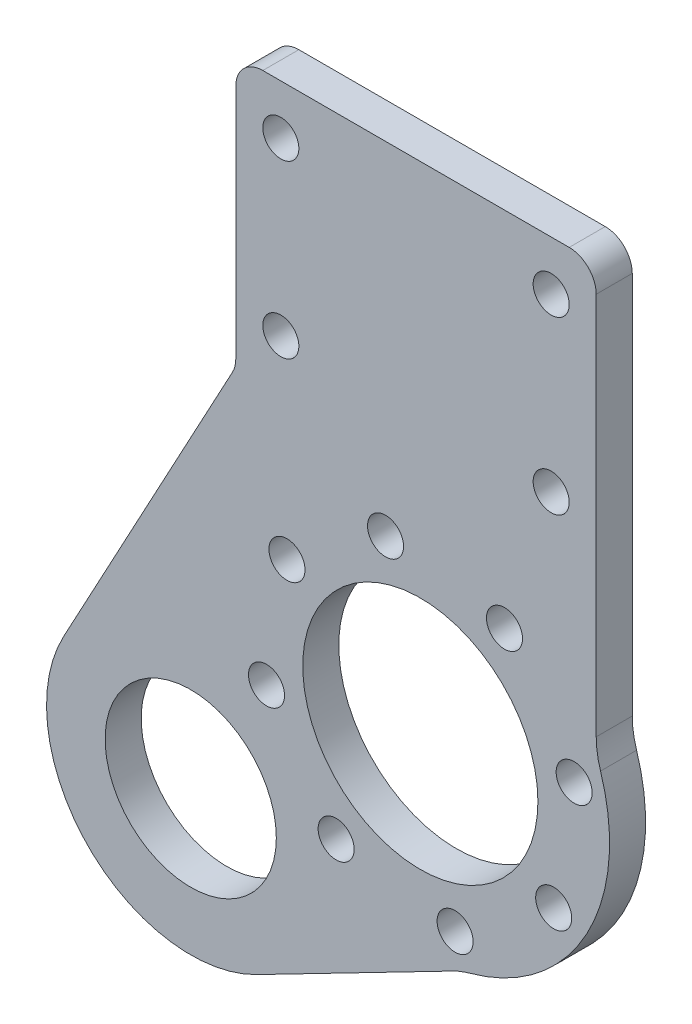
ISO-10303-21;
HEADER;
FILE_DESCRIPTION(('STEP AP214'),'2;1');
FILE_NAME('part.step','',(''),(''),'','','');
FILE_SCHEMA(('AUTOMOTIVE_DESIGN { 1 0 10303 214 1 1 1 1 }'));
ENDSEC;
DATA;
#1=APPLICATION_CONTEXT('core data for automotive mechanical design processes');
#2=APPLICATION_PROTOCOL_DEFINITION('international standard','automotive_design',2000,#1);
#3=PRODUCT_CONTEXT('',#1,'mechanical');
#4=PRODUCT('Part','Part','',(#3));
#5=PRODUCT_RELATED_PRODUCT_CATEGORY('part','',(#4));
#6=PRODUCT_DEFINITION_FORMATION('','',#4);
#7=PRODUCT_DEFINITION_CONTEXT('part definition',#1,'design');
#8=PRODUCT_DEFINITION('design','',#6,#7);
#9=PRODUCT_DEFINITION_SHAPE('','',#8);
#10=(LENGTH_UNIT() NAMED_UNIT(*) SI_UNIT(.MILLI.,.METRE.));
#11=(NAMED_UNIT(*) PLANE_ANGLE_UNIT() SI_UNIT($,.RADIAN.));
#12=(NAMED_UNIT(*) SI_UNIT($,.STERADIAN.) SOLID_ANGLE_UNIT());
#13=UNCERTAINTY_MEASURE_WITH_UNIT(LENGTH_MEASURE(1.E-05),#10,'distance_accuracy_value','');
#14=(GEOMETRIC_REPRESENTATION_CONTEXT(3) GLOBAL_UNCERTAINTY_ASSIGNED_CONTEXT((#13)) GLOBAL_UNIT_ASSIGNED_CONTEXT((#10,
#11,#12)) REPRESENTATION_CONTEXT('',''));
#15=CARTESIAN_POINT('',(0.,0.,0.));
#16=DIRECTION('',(0.,0.,1.));
#17=DIRECTION('',(1.,0.,0.));
#18=AXIS2_PLACEMENT_3D('',#15,#16,#17);
#19=CARTESIAN_POINT('',(24.,18.,4.));
#20=DIRECTION('',(0.,0.,1.));
#21=DIRECTION('',(1.,0.,0.));
#22=AXIS2_PLACEMENT_3D('',#19,#20,#21);
#23=PLANE('',#22);
#24=CARTESIAN_POINT('',(21.6211386934791,35.06924689074,4.));
#25=DIRECTION('',(0.,0.,1.));
#26=DIRECTION('',(1.,0.,0.));
#27=AXIS2_PLACEMENT_3D('',#24,#25,#26);
#28=CIRCLE('',#27,2.00000000000001);
#29=CARTESIAN_POINT('',(23.6211386934791,35.06924689074,4.));
#30=VERTEX_POINT('',#29);
#31=EDGE_CURVE('E563',#30,#30,#28,.T.);
#32=ORIENTED_EDGE('',*,*,#31,.F.);
#33=EDGE_LOOP('',(#32));
#34=FACE_BOUND('',#33,.T.);
#35=CARTESIAN_POINT('',(34.8211532286903,32.7984072236889,4.));
#36=DIRECTION('',(0.,0.,1.));
#37=DIRECTION('',(1.,0.,0.));
#38=AXIS2_PLACEMENT_3D('',#35,#36,#37);
#39=CIRCLE('',#38,2.);
#40=CARTESIAN_POINT('',(36.8211532286903,32.7984072236889,4.));
#41=VERTEX_POINT('',#40);
#42=EDGE_CURVE('E560',#41,#41,#39,.T.);
#43=ORIENTED_EDGE('',*,*,#42,.F.);
#44=EDGE_LOOP('',(#43));
#45=FACE_BOUND('',#44,.T.);
#46=CARTESIAN_POINT('',(42.54924689074,21.8588613065209,4.));
#47=DIRECTION('',(0.,0.,1.));
#48=DIRECTION('',(1.,0.,0.));
#49=AXIS2_PLACEMENT_3D('',#46,#47,#48);
#50=CIRCLE('',#49,2.);
#51=CARTESIAN_POINT('',(44.54924689074,21.8588613065209,4.));
#52=VERTEX_POINT('',#51);
#53=EDGE_CURVE('E566',#52,#52,#50,.T.);
#54=ORIENTED_EDGE('',*,*,#53,.F.);
#55=EDGE_LOOP('',(#54));
#56=FACE_BOUND('',#55,.T.);
#57=CARTESIAN_POINT('',(40.2784072236889,8.65884677130965,4.));
#58=DIRECTION('',(0.,0.,1.));
#59=DIRECTION('',(1.,0.,0.));
#60=AXIS2_PLACEMENT_3D('',#57,#58,#59);
#61=CIRCLE('',#60,2.);
#62=CARTESIAN_POINT('',(42.2784072236889,8.65884677130965,4.));
#63=VERTEX_POINT('',#62);
#64=EDGE_CURVE('E575',#63,#63,#61,.T.);
#65=ORIENTED_EDGE('',*,*,#64,.F.);
#66=EDGE_LOOP('',(#65));
#67=FACE_BOUND('',#66,.T.);
#68=CARTESIAN_POINT('',(29.3388613065209,0.930753109260019,4.));
#69=DIRECTION('',(0.,0.,1.));
#70=DIRECTION('',(1.,0.,0.));
#71=AXIS2_PLACEMENT_3D('',#68,#69,#70);
#72=CIRCLE('',#71,2.);
#73=CARTESIAN_POINT('',(31.3388613065209,0.930753109260019,4.));
#74=VERTEX_POINT('',#73);
#75=EDGE_CURVE('E641',#74,#74,#72,.T.);
#76=ORIENTED_EDGE('',*,*,#75,.F.);
#77=EDGE_LOOP('',(#76));
#78=FACE_BOUND('',#77,.T.);
#79=CARTESIAN_POINT('',(16.1388467713097,3.20159277631108,4.));
#80=DIRECTION('',(0.,0.,1.));
#81=DIRECTION('',(1.,0.,0.));
#82=AXIS2_PLACEMENT_3D('',#79,#80,#81);
#83=CIRCLE('',#82,2.);
#84=CARTESIAN_POINT('',(18.1388467713097,3.20159277631108,4.));
#85=VERTEX_POINT('',#84);
#86=EDGE_CURVE('E634',#85,#85,#83,.T.);
#87=ORIENTED_EDGE('',*,*,#86,.F.);
#88=EDGE_LOOP('',(#87));
#89=FACE_BOUND('',#88,.T.);
#90=CARTESIAN_POINT('',(8.41075310926003,14.1411386934791,4.));
#91=DIRECTION('',(0.,0.,1.));
#92=DIRECTION('',(1.,0.,0.));
#93=AXIS2_PLACEMENT_3D('',#90,#91,#92);
#94=CIRCLE('',#93,2.);
#95=CARTESIAN_POINT('',(10.41075310926,14.1411386934791,4.));
#96=VERTEX_POINT('',#95);
#97=EDGE_CURVE('E635',#96,#96,#94,.T.);
#98=ORIENTED_EDGE('',*,*,#97,.F.);
#99=EDGE_LOOP('',(#98));
#100=FACE_BOUND('',#99,.T.);
#101=CARTESIAN_POINT('',(10.6815927763111,27.3411532286903,4.));
#102=DIRECTION('',(0.,0.,1.));
#103=DIRECTION('',(1.,0.,0.));
#104=AXIS2_PLACEMENT_3D('',#101,#102,#103);
#105=CIRCLE('',#104,2.);
#106=CARTESIAN_POINT('',(12.6815927763111,27.3411532286903,4.));
#107=VERTEX_POINT('',#106);
#108=EDGE_CURVE('E581',#107,#107,#105,.T.);
#109=ORIENTED_EDGE('',*,*,#108,.F.);
#110=EDGE_LOOP('',(#109));
#111=FACE_BOUND('',#110,.T.);
#112=CARTESIAN_POINT('',(25.48,18.,4.));
#113=DIRECTION('',(0.,0.,1.));
#114=DIRECTION('',(1.,0.,0.));
#115=AXIS2_PLACEMENT_3D('',#112,#113,#114);
#116=CIRCLE('',#115,13.05);
#117=CARTESIAN_POINT('',(38.53,18.,4.));
#118=VERTEX_POINT('',#117);
#119=EDGE_CURVE('E587',#118,#118,#116,.T.);
#120=ORIENTED_EDGE('',*,*,#119,.F.);
#121=EDGE_LOOP('',(#120));
#122=FACE_BOUND('',#121,.T.);
#123=DIRECTION('',(0.888810637746616,0.458274644976628,0.));
#124=VECTOR('',#123,1.);
#125=CARTESIAN_POINT('',(7.33239431962605,-14.2209702039459,4.));
#126=LINE('',#125,#124);
#127=CARTESIAN_POINT('',(7.33239431962604,-14.2209702039459,4.));
#128=VERTEX_POINT('',#127);
#129=CARTESIAN_POINT('',(29.0608900410088,-3.01766295299055,4.));
#130=VERTEX_POINT('',#129);
#131=EDGE_CURVE('E132',#128,#130,#126,.T.);
#132=ORIENTED_EDGE('',*,*,#131,.T.);
#133=CARTESIAN_POINT('',(33.6436364907751,-11.9057693304567,4.));
#134=DIRECTION('',(0.,0.,1.));
#135=DIRECTION('',(1.,0.,0.));
#136=AXIS2_PLACEMENT_3D('',#133,#134,#135);
#137=CIRCLE('',#136,10.);
#138=CARTESIAN_POINT('',(31.0102053647186,-2.25874696579326,4.));
#139=VERTEX_POINT('',#138);
#140=EDGE_CURVE('E230',#130,#139,#137,.F.);
#141=ORIENTED_EDGE('',*,*,#140,.T.);
#142=CARTESIAN_POINT('',(25.48,18.,4.));
#143=DIRECTION('',(0.,0.,1.));
#144=DIRECTION('',(1.,0.,0.));
#145=AXIS2_PLACEMENT_3D('',#142,#143,#144);
#146=CIRCLE('',#145,21.);
#147=CARTESIAN_POINT('',(45.4774193548387,24.4111792321477,4.));
#148=VERTEX_POINT('',#147);
#149=EDGE_CURVE('E246',#139,#148,#146,.T.);
#150=ORIENTED_EDGE('',*,*,#149,.T.);
#151=CARTESIAN_POINT('',(55.,27.4641217236466,4.));
#152=DIRECTION('',(0.,0.,1.));
#153=DIRECTION('',(1.,0.,0.));
#154=AXIS2_PLACEMENT_3D('',#151,#152,#153);
#155=CIRCLE('',#154,10.);
#156=CARTESIAN_POINT('',(45.,27.4641217236466,4.));
#157=VERTEX_POINT('',#156);
#158=EDGE_CURVE('E11',#148,#157,#155,.F.);
#159=ORIENTED_EDGE('',*,*,#158,.T.);
#160=DIRECTION('',(0.,1.,0.));
#161=VECTOR('',#160,1.);
#162=CARTESIAN_POINT('',(45.,73.,4.));
#163=LINE('',#162,#161);
#164=CARTESIAN_POINT('',(45.,70.,4.));
#165=VERTEX_POINT('',#164);
#166=EDGE_CURVE('E173',#157,#165,#163,.T.);
#167=ORIENTED_EDGE('',*,*,#166,.T.);
#168=CARTESIAN_POINT('',(42.,70.,4.));
#169=DIRECTION('',(0.,0.,1.));
#170=DIRECTION('',(1.,0.,0.));
#171=AXIS2_PLACEMENT_3D('',#168,#169,#170);
#172=CIRCLE('',#171,3.);
#173=CARTESIAN_POINT('',(42.,73.,4.));
#174=VERTEX_POINT('',#173);
#175=EDGE_CURVE('E193',#165,#174,#172,.T.);
#176=ORIENTED_EDGE('',*,*,#175,.T.);
#177=DIRECTION('',(-1.,0.,0.));
#178=VECTOR('',#177,1.);
#179=CARTESIAN_POINT('',(-16.,73.,4.));
#180=LINE('',#179,#178);
#181=CARTESIAN_POINT('',(8.,73.,4.));
#182=VERTEX_POINT('',#181);
#183=EDGE_CURVE('E133',#174,#182,#180,.T.);
#184=ORIENTED_EDGE('',*,*,#183,.T.);
#185=CARTESIAN_POINT('',(8.,70.,4.));
#186=DIRECTION('',(0.,0.,1.));
#187=DIRECTION('',(1.,0.,0.));
#188=AXIS2_PLACEMENT_3D('',#185,#186,#187);
#189=CIRCLE('',#188,3.);
#190=CARTESIAN_POINT('',(5.,70.,4.));
#191=VERTEX_POINT('',#190);
#192=EDGE_CURVE('E206',#182,#191,#189,.T.);
#193=ORIENTED_EDGE('',*,*,#192,.T.);
#194=DIRECTION('',(0.,1.,0.));
#195=VECTOR('',#194,1.);
#196=CARTESIAN_POINT('',(5.,43.,4.));
#197=LINE('',#196,#195);
#198=CARTESIAN_POINT('',(5.,43.7569898030261,4.));
#199=VERTEX_POINT('',#198);
#200=EDGE_CURVE('E144',#199,#191,#197,.T.);
#201=ORIENTED_EDGE('',*,*,#200,.F.);
#202=CARTESIAN_POINT('',(2.,43.7569898030261,4.));
#203=DIRECTION('',(0.,0.,1.));
#204=DIRECTION('',(1.,0.,0.));
#205=AXIS2_PLACEMENT_3D('',#202,#203,#204);
#206=CIRCLE('',#205,3.);
#207=CARTESIAN_POINT('',(4.64084515644005,42.333635715068,4.));
#208=VERTEX_POINT('',#207);
#209=EDGE_CURVE('E148',#199,#208,#206,.F.);
#210=ORIENTED_EDGE('',*,*,#209,.T.);
#211=DIRECTION('',(0.474451362652715,0.880281718813348,0.));
#212=VECTOR('',#211,1.);
#213=CARTESIAN_POINT('',(-14.0845075010136,7.59122180244344,4.));
#214=LINE('',#213,#212);
#215=CARTESIAN_POINT('',(-14.0845075010136,7.59122180244344,4.));
#216=VERTEX_POINT('',#215);
#217=EDGE_CURVE('E139',#216,#208,#214,.T.);
#218=ORIENTED_EDGE('',*,*,#217,.F.);
#219=CARTESIAN_POINT('',(0.,0.,4.));
#220=DIRECTION('',(0.,0.,1.));
#221=DIRECTION('',(1.,0.,0.));
#222=AXIS2_PLACEMENT_3D('',#219,#220,#221);
#223=CIRCLE('',#222,16.);
#224=EDGE_CURVE('E123',#216,#128,#223,.T.);
#225=ORIENTED_EDGE('',*,*,#224,.T.);
#226=EDGE_LOOP('',(#132,#141,#150,#159,#167,#176,#184,#193,#201,#210,#218,#225));
#227=FACE_BOUND('',#226,.T.);
#228=CARTESIAN_POINT('',(40.,48.5,4.));
#229=DIRECTION('',(0.,0.,1.));
#230=DIRECTION('',(1.,0.,0.));
#231=AXIS2_PLACEMENT_3D('',#228,#229,#230);
#232=CIRCLE('',#231,2.);
#233=CARTESIAN_POINT('',(42.,48.5,4.));
#234=VERTEX_POINT('',#233);
#235=EDGE_CURVE('E245',#234,#234,#232,.T.);
#236=ORIENTED_EDGE('',*,*,#235,.F.);
#237=EDGE_LOOP('',(#236));
#238=FACE_BOUND('',#237,.T.);
#239=CARTESIAN_POINT('',(9.99999999999999,48.5,4.));
#240=DIRECTION('',(0.,0.,1.));
#241=DIRECTION('',(1.,0.,0.));
#242=AXIS2_PLACEMENT_3D('',#239,#240,#241);
#243=CIRCLE('',#242,2.);
#244=CARTESIAN_POINT('',(12.,48.5,4.));
#245=VERTEX_POINT('',#244);
#246=EDGE_CURVE('E595',#245,#245,#243,.T.);
#247=ORIENTED_EDGE('',*,*,#246,.F.);
#248=EDGE_LOOP('',(#247));
#249=FACE_BOUND('',#248,.T.);
#250=CARTESIAN_POINT('',(9.99999999999999,67.5,4.));
#251=DIRECTION('',(0.,0.,1.));
#252=DIRECTION('',(1.,0.,0.));
#253=AXIS2_PLACEMENT_3D('',#250,#251,#252);
#254=CIRCLE('',#253,2.);
#255=CARTESIAN_POINT('',(12.,67.5,4.));
#256=VERTEX_POINT('',#255);
#257=EDGE_CURVE('E592',#256,#256,#254,.T.);
#258=ORIENTED_EDGE('',*,*,#257,.F.);
#259=EDGE_LOOP('',(#258));
#260=FACE_BOUND('',#259,.T.);
#261=CARTESIAN_POINT('',(40.,67.5,4.));
#262=DIRECTION('',(0.,0.,1.));
#263=DIRECTION('',(1.,0.,0.));
#264=AXIS2_PLACEMENT_3D('',#261,#262,#263);
#265=CIRCLE('',#264,2.);
#266=CARTESIAN_POINT('',(42.,67.5,4.));
#267=VERTEX_POINT('',#266);
#268=EDGE_CURVE('E157',#267,#267,#265,.T.);
#269=ORIENTED_EDGE('',*,*,#268,.F.);
#270=EDGE_LOOP('',(#269));
#271=FACE_BOUND('',#270,.T.);
#272=CARTESIAN_POINT('',(0.,0.,4.));
#273=DIRECTION('',(0.,0.,1.));
#274=DIRECTION('',(1.,0.,0.));
#275=AXIS2_PLACEMENT_3D('',#272,#273,#274);
#276=CIRCLE('',#275,9.5);
#277=CARTESIAN_POINT('',(9.5,0.,4.));
#278=VERTEX_POINT('',#277);
#279=EDGE_CURVE('E163',#278,#278,#276,.T.);
#280=ORIENTED_EDGE('',*,*,#279,.F.);
#281=EDGE_LOOP('',(#280));
#282=FACE_BOUND('',#281,.T.);
#283=ADVANCED_FACE('F35',(#34,#45,#56,#67,#78,#89,#100,#111,#122,#227,#238,#249,#260,#271,#282),
#23,.T.);
#284=CARTESIAN_POINT('',(24.,18.,0.));
#285=DIRECTION('',(0.,0.,1.));
#286=DIRECTION('',(1.,0.,0.));
#287=AXIS2_PLACEMENT_3D('',#284,#285,#286);
#288=PLANE('',#287);
#289=CARTESIAN_POINT('',(21.6211386934791,35.06924689074,0.));
#290=DIRECTION('',(0.,0.,1.));
#291=DIRECTION('',(1.,0.,0.));
#292=AXIS2_PLACEMENT_3D('',#289,#290,#291);
#293=CIRCLE('',#292,2.00000000000001);
#294=CARTESIAN_POINT('',(23.6211386934791,35.06924689074,0.));
#295=VERTEX_POINT('',#294);
#296=EDGE_CURVE('E569',#295,#295,#293,.F.);
#297=ORIENTED_EDGE('',*,*,#296,.F.);
#298=EDGE_LOOP('',(#297));
#299=FACE_BOUND('',#298,.T.);
#300=CARTESIAN_POINT('',(34.8211532286903,32.7984072236889,0.));
#301=DIRECTION('',(0.,0.,1.));
#302=DIRECTION('',(1.,0.,0.));
#303=AXIS2_PLACEMENT_3D('',#300,#301,#302);
#304=CIRCLE('',#303,2.);
#305=CARTESIAN_POINT('',(36.8211532286903,32.7984072236889,0.));
#306=VERTEX_POINT('',#305);
#307=EDGE_CURVE('E557',#306,#306,#304,.F.);
#308=ORIENTED_EDGE('',*,*,#307,.F.);
#309=EDGE_LOOP('',(#308));
#310=FACE_BOUND('',#309,.T.);
#311=CARTESIAN_POINT('',(42.54924689074,21.8588613065209,0.));
#312=DIRECTION('',(0.,0.,1.));
#313=DIRECTION('',(1.,0.,0.));
#314=AXIS2_PLACEMENT_3D('',#311,#312,#313);
#315=CIRCLE('',#314,2.);
#316=CARTESIAN_POINT('',(44.54924689074,21.8588613065209,0.));
#317=VERTEX_POINT('',#316);
#318=EDGE_CURVE('E561',#317,#317,#315,.F.);
#319=ORIENTED_EDGE('',*,*,#318,.F.);
#320=EDGE_LOOP('',(#319));
#321=FACE_BOUND('',#320,.T.);
#322=CARTESIAN_POINT('',(40.2784072236889,8.65884677130965,0.));
#323=DIRECTION('',(0.,0.,1.));
#324=DIRECTION('',(1.,0.,0.));
#325=AXIS2_PLACEMENT_3D('',#322,#323,#324);
#326=CIRCLE('',#325,2.);
#327=CARTESIAN_POINT('',(42.2784072236889,8.65884677130965,0.));
#328=VERTEX_POINT('',#327);
#329=EDGE_CURVE('E573',#328,#328,#326,.F.);
#330=ORIENTED_EDGE('',*,*,#329,.F.);
#331=EDGE_LOOP('',(#330));
#332=FACE_BOUND('',#331,.T.);
#333=CARTESIAN_POINT('',(29.3388613065209,0.930753109260019,0.));
#334=DIRECTION('',(0.,0.,1.));
#335=DIRECTION('',(1.,0.,0.));
#336=AXIS2_PLACEMENT_3D('',#333,#334,#335);
#337=CIRCLE('',#336,2.);
#338=CARTESIAN_POINT('',(31.3388613065209,0.930753109260019,0.));
#339=VERTEX_POINT('',#338);
#340=EDGE_CURVE('E578',#339,#339,#337,.F.);
#341=ORIENTED_EDGE('',*,*,#340,.F.);
#342=EDGE_LOOP('',(#341));
#343=FACE_BOUND('',#342,.T.);
#344=CARTESIAN_POINT('',(16.1388467713097,3.20159277631108,0.));
#345=DIRECTION('',(0.,0.,1.));
#346=DIRECTION('',(1.,0.,0.));
#347=AXIS2_PLACEMENT_3D('',#344,#345,#346);
#348=CIRCLE('',#347,2.);
#349=CARTESIAN_POINT('',(18.1388467713097,3.20159277631108,0.));
#350=VERTEX_POINT('',#349);
#351=EDGE_CURVE('E638',#350,#350,#348,.F.);
#352=ORIENTED_EDGE('',*,*,#351,.F.);
#353=EDGE_LOOP('',(#352));
#354=FACE_BOUND('',#353,.T.);
#355=CARTESIAN_POINT('',(8.41075310926003,14.1411386934791,0.));
#356=DIRECTION('',(0.,0.,1.));
#357=DIRECTION('',(1.,0.,0.));
#358=AXIS2_PLACEMENT_3D('',#355,#356,#357);
#359=CIRCLE('',#358,2.);
#360=CARTESIAN_POINT('',(10.41075310926,14.1411386934791,0.));
#361=VERTEX_POINT('',#360);
#362=EDGE_CURVE('E631',#361,#361,#359,.F.);
#363=ORIENTED_EDGE('',*,*,#362,.F.);
#364=EDGE_LOOP('',(#363));
#365=FACE_BOUND('',#364,.T.);
#366=CARTESIAN_POINT('',(10.6815927763111,27.3411532286903,0.));
#367=DIRECTION('',(0.,0.,1.));
#368=DIRECTION('',(1.,0.,0.));
#369=AXIS2_PLACEMENT_3D('',#366,#367,#368);
#370=CIRCLE('',#369,2.);
#371=CARTESIAN_POINT('',(12.6815927763111,27.3411532286903,0.));
#372=VERTEX_POINT('',#371);
#373=EDGE_CURVE('E584',#372,#372,#370,.F.);
#374=ORIENTED_EDGE('',*,*,#373,.F.);
#375=EDGE_LOOP('',(#374));
#376=FACE_BOUND('',#375,.T.);
#377=CARTESIAN_POINT('',(25.48,18.,0.));
#378=DIRECTION('',(0.,0.,1.));
#379=DIRECTION('',(1.,0.,0.));
#380=AXIS2_PLACEMENT_3D('',#377,#378,#379);
#381=CIRCLE('',#380,13.05);
#382=CARTESIAN_POINT('',(38.53,18.,0.));
#383=VERTEX_POINT('',#382);
#384=EDGE_CURVE('E276',#383,#383,#381,.F.);
#385=ORIENTED_EDGE('',*,*,#384,.F.);
#386=EDGE_LOOP('',(#385));
#387=FACE_BOUND('',#386,.T.);
#388=CARTESIAN_POINT('',(40.,48.5,0.));
#389=DIRECTION('',(0.,0.,1.));
#390=DIRECTION('',(1.,0.,0.));
#391=AXIS2_PLACEMENT_3D('',#388,#389,#390);
#392=CIRCLE('',#391,2.);
#393=CARTESIAN_POINT('',(42.,48.5,0.));
#394=VERTEX_POINT('',#393);
#395=EDGE_CURVE('E149',#394,#394,#392,.T.);
#396=ORIENTED_EDGE('',*,*,#395,.T.);
#397=EDGE_LOOP('',(#396));
#398=FACE_BOUND('',#397,.T.);
#399=CARTESIAN_POINT('',(9.99999999999999,48.5,0.));
#400=DIRECTION('',(0.,0.,1.));
#401=DIRECTION('',(1.,0.,0.));
#402=AXIS2_PLACEMENT_3D('',#399,#400,#401);
#403=CIRCLE('',#402,2.);
#404=CARTESIAN_POINT('',(12.,48.5,0.));
#405=VERTEX_POINT('',#404);
#406=EDGE_CURVE('E154',#405,#405,#403,.T.);
#407=ORIENTED_EDGE('',*,*,#406,.T.);
#408=EDGE_LOOP('',(#407));
#409=FACE_BOUND('',#408,.T.);
#410=CARTESIAN_POINT('',(9.99999999999999,67.5,0.));
#411=DIRECTION('',(0.,0.,1.));
#412=DIRECTION('',(1.,0.,0.));
#413=AXIS2_PLACEMENT_3D('',#410,#411,#412);
#414=CIRCLE('',#413,2.);
#415=CARTESIAN_POINT('',(12.,67.5,0.));
#416=VERTEX_POINT('',#415);
#417=EDGE_CURVE('E217',#416,#416,#414,.T.);
#418=ORIENTED_EDGE('',*,*,#417,.T.);
#419=EDGE_LOOP('',(#418));
#420=FACE_BOUND('',#419,.T.);
#421=CARTESIAN_POINT('',(40.,67.5,0.));
#422=DIRECTION('',(0.,0.,1.));
#423=DIRECTION('',(1.,0.,0.));
#424=AXIS2_PLACEMENT_3D('',#421,#422,#423);
#425=CIRCLE('',#424,2.);
#426=CARTESIAN_POINT('',(42.,67.5,0.));
#427=VERTEX_POINT('',#426);
#428=EDGE_CURVE('E214',#427,#427,#425,.T.);
#429=ORIENTED_EDGE('',*,*,#428,.T.);
#430=EDGE_LOOP('',(#429));
#431=FACE_BOUND('',#430,.T.);
#432=DIRECTION('',(0.,1.,0.));
#433=VECTOR('',#432,1.);
#434=CARTESIAN_POINT('',(45.,73.,0.));
#435=LINE('',#434,#433);
#436=CARTESIAN_POINT('',(45.,27.4641217236466,0.));
#437=VERTEX_POINT('',#436);
#438=CARTESIAN_POINT('',(45.,70.,0.));
#439=VERTEX_POINT('',#438);
#440=EDGE_CURVE('E170',#437,#439,#435,.T.);
#441=ORIENTED_EDGE('',*,*,#440,.F.);
#442=CARTESIAN_POINT('',(55.,27.4641217236466,0.));
#443=DIRECTION('',(0.,0.,1.));
#444=DIRECTION('',(1.,0.,0.));
#445=AXIS2_PLACEMENT_3D('',#442,#443,#444);
#446=CIRCLE('',#445,10.);
#447=CARTESIAN_POINT('',(45.4774193548387,24.4111792321477,0.));
#448=VERTEX_POINT('',#447);
#449=EDGE_CURVE('E43',#437,#448,#446,.T.);
#450=ORIENTED_EDGE('',*,*,#449,.T.);
#451=CARTESIAN_POINT('',(25.48,18.,0.));
#452=DIRECTION('',(0.,0.,1.));
#453=DIRECTION('',(1.,0.,0.));
#454=AXIS2_PLACEMENT_3D('',#451,#452,#453);
#455=CIRCLE('',#454,21.);
#456=CARTESIAN_POINT('',(31.0102053647186,-2.25874696579326,0.));
#457=VERTEX_POINT('',#456);
#458=EDGE_CURVE('E239',#448,#457,#455,.F.);
#459=ORIENTED_EDGE('',*,*,#458,.T.);
#460=CARTESIAN_POINT('',(33.6436364907751,-11.9057693304567,0.));
#461=DIRECTION('',(0.,0.,1.));
#462=DIRECTION('',(1.,0.,0.));
#463=AXIS2_PLACEMENT_3D('',#460,#461,#462);
#464=CIRCLE('',#463,10.);
#465=CARTESIAN_POINT('',(29.0608900410088,-3.01766295299055,0.));
#466=VERTEX_POINT('',#465);
#467=EDGE_CURVE('E232',#457,#466,#464,.T.);
#468=ORIENTED_EDGE('',*,*,#467,.T.);
#469=DIRECTION('',(0.888810637746616,0.458274644976628,0.));
#470=VECTOR('',#469,1.);
#471=CARTESIAN_POINT('',(7.33239431962605,-14.2209702039459,0.));
#472=LINE('',#471,#470);
#473=CARTESIAN_POINT('',(7.33239431962604,-14.2209702039459,0.));
#474=VERTEX_POINT('',#473);
#475=EDGE_CURVE('E179',#474,#466,#472,.T.);
#476=ORIENTED_EDGE('',*,*,#475,.F.);
#477=CARTESIAN_POINT('',(0.,0.,0.));
#478=DIRECTION('',(0.,0.,1.));
#479=DIRECTION('',(1.,0.,0.));
#480=AXIS2_PLACEMENT_3D('',#477,#478,#479);
#481=CIRCLE('',#480,16.);
#482=CARTESIAN_POINT('',(-14.0845075010136,7.59122180244344,0.));
#483=VERTEX_POINT('',#482);
#484=EDGE_CURVE('E177',#483,#474,#481,.T.);
#485=ORIENTED_EDGE('',*,*,#484,.F.);
#486=DIRECTION('',(0.474451362652715,0.880281718813348,0.));
#487=VECTOR('',#486,1.);
#488=CARTESIAN_POINT('',(-1.16429371029433,31.5629687472515,0.));
#489=LINE('',#488,#487);
#490=CARTESIAN_POINT('',(4.64084515644005,42.333635715068,0.));
#491=VERTEX_POINT('',#490);
#492=EDGE_CURVE('E142',#483,#491,#489,.T.);
#493=ORIENTED_EDGE('',*,*,#492,.T.);
#494=CARTESIAN_POINT('',(2.,43.7569898030261,0.));
#495=DIRECTION('',(0.,0.,1.));
#496=DIRECTION('',(1.,0.,0.));
#497=AXIS2_PLACEMENT_3D('',#494,#495,#496);
#498=CIRCLE('',#497,3.);
#499=CARTESIAN_POINT('',(5.,43.7569898030261,0.));
#500=VERTEX_POINT('',#499);
#501=EDGE_CURVE('E211',#491,#500,#498,.T.);
#502=ORIENTED_EDGE('',*,*,#501,.T.);
#503=DIRECTION('',(0.,1.,0.));
#504=VECTOR('',#503,1.);
#505=CARTESIAN_POINT('',(5.,18.,0.));
#506=LINE('',#505,#504);
#507=CARTESIAN_POINT('',(5.,70.,0.));
#508=VERTEX_POINT('',#507);
#509=EDGE_CURVE('E143',#500,#508,#506,.T.);
#510=ORIENTED_EDGE('',*,*,#509,.T.);
#511=CARTESIAN_POINT('',(8.,70.,0.));
#512=DIRECTION('',(0.,0.,1.));
#513=DIRECTION('',(1.,0.,0.));
#514=AXIS2_PLACEMENT_3D('',#511,#512,#513);
#515=CIRCLE('',#514,3.);
#516=CARTESIAN_POINT('',(8.,73.,0.));
#517=VERTEX_POINT('',#516);
#518=EDGE_CURVE('E208',#508,#517,#515,.F.);
#519=ORIENTED_EDGE('',*,*,#518,.T.);
#520=DIRECTION('',(-1.,0.,0.));
#521=VECTOR('',#520,1.);
#522=CARTESIAN_POINT('',(-16.,73.,0.));
#523=LINE('',#522,#521);
#524=CARTESIAN_POINT('',(42.,73.,0.));
#525=VERTEX_POINT('',#524);
#526=EDGE_CURVE('E166',#525,#517,#523,.T.);
#527=ORIENTED_EDGE('',*,*,#526,.F.);
#528=CARTESIAN_POINT('',(42.,70.,0.));
#529=DIRECTION('',(0.,0.,1.));
#530=DIRECTION('',(1.,0.,0.));
#531=AXIS2_PLACEMENT_3D('',#528,#529,#530);
#532=CIRCLE('',#531,3.);
#533=EDGE_CURVE('E187',#525,#439,#532,.F.);
#534=ORIENTED_EDGE('',*,*,#533,.T.);
#535=EDGE_LOOP('',(#441,#450,#459,#468,#476,#485,#493,#502,#510,#519,#527,#534));
#536=FACE_BOUND('',#535,.T.);
#537=CARTESIAN_POINT('',(0.,0.,0.));
#538=DIRECTION('',(0.,0.,1.));
#539=DIRECTION('',(1.,0.,0.));
#540=AXIS2_PLACEMENT_3D('',#537,#538,#539);
#541=CIRCLE('',#540,9.5);
#542=CARTESIAN_POINT('',(9.5,0.,0.));
#543=VERTEX_POINT('',#542);
#544=EDGE_CURVE('E162',#543,#543,#541,.T.);
#545=ORIENTED_EDGE('',*,*,#544,.T.);
#546=EDGE_LOOP('',(#545));
#547=FACE_BOUND('',#546,.T.);
#548=ADVANCED_FACE('F237',(#299,#310,#321,#332,#343,#354,#365,#376,#387,#398,#409,#420,#431,
#536,#547),#288,.F.);
#549=CARTESIAN_POINT('',(-16.,73.,4.));
#550=DIRECTION('',(0.,-1.,0.));
#551=DIRECTION('',(0.,0.,-1.));
#552=AXIS2_PLACEMENT_3D('',#549,#550,#551);
#553=PLANE('',#552);
#554=ORIENTED_EDGE('',*,*,#526,.T.);
#555=DIRECTION('',(0.,0.,1.));
#556=VECTOR('',#555,1.);
#557=CARTESIAN_POINT('',(8.,73.,4.));
#558=LINE('',#557,#556);
#559=EDGE_CURVE('E203',#517,#182,#558,.T.);
#560=ORIENTED_EDGE('',*,*,#559,.T.);
#561=ORIENTED_EDGE('',*,*,#183,.F.);
#562=DIRECTION('',(0.,0.,-1.));
#563=VECTOR('',#562,1.);
#564=CARTESIAN_POINT('',(42.,73.,4.));
#565=LINE('',#564,#563);
#566=EDGE_CURVE('E184',#174,#525,#565,.T.);
#567=ORIENTED_EDGE('',*,*,#566,.T.);
#568=EDGE_LOOP('',(#554,#560,#561,#567));
#569=FACE_BOUND('',#568,.T.);
#570=ADVANCED_FACE('F256',(#569),#553,.F.);
#571=CARTESIAN_POINT('',(0.,0.,4.));
#572=DIRECTION('',(0.,0.,-1.));
#573=DIRECTION('',(-1.,0.,0.));
#574=AXIS2_PLACEMENT_3D('',#571,#572,#573);
#575=CYLINDRICAL_SURFACE('',#574,16.);
#576=ORIENTED_EDGE('',*,*,#484,.T.);
#577=DIRECTION('',(0.,0.,-1.));
#578=VECTOR('',#577,1.);
#579=CARTESIAN_POINT('',(7.33239431962604,-14.2209702039459,4.));
#580=LINE('',#579,#578);
#581=EDGE_CURVE('E128',#128,#474,#580,.T.);
#582=ORIENTED_EDGE('',*,*,#581,.F.);
#583=ORIENTED_EDGE('',*,*,#224,.F.);
#584=DIRECTION('',(0.,0.,1.));
#585=VECTOR('',#584,1.);
#586=CARTESIAN_POINT('',(-14.0845075010136,7.59122180244344,-6.));
#587=LINE('',#586,#585);
#588=EDGE_CURVE('E126',#483,#216,#587,.T.);
#589=ORIENTED_EDGE('',*,*,#588,.F.);
#590=EDGE_LOOP('',(#576,#582,#583,#589));
#591=FACE_BOUND('',#590,.T.);
#592=ADVANCED_FACE('F125',(#591),#575,.T.);
#593=CARTESIAN_POINT('',(7.33239431962605,-14.2209702039459,4.));
#594=DIRECTION('',(-0.458274644976628,0.888810637746616,0.));
#595=DIRECTION('',(-0.888810637746616,-0.458274644976628,0.));
#596=AXIS2_PLACEMENT_3D('',#593,#594,#595);
#597=PLANE('',#596);
#598=ORIENTED_EDGE('',*,*,#475,.T.);
#599=DIRECTION('',(0.,0.,1.));
#600=VECTOR('',#599,1.);
#601=CARTESIAN_POINT('',(29.0608900410088,-3.01766295299055,4.));
#602=LINE('',#601,#600);
#603=EDGE_CURVE('E213',#466,#130,#602,.T.);
#604=ORIENTED_EDGE('',*,*,#603,.T.);
#605=ORIENTED_EDGE('',*,*,#131,.F.);
#606=ORIENTED_EDGE('',*,*,#581,.T.);
#607=EDGE_LOOP('',(#598,#604,#605,#606));
#608=FACE_BOUND('',#607,.T.);
#609=ADVANCED_FACE('F273',(#608),#597,.F.);
#610=CARTESIAN_POINT('',(45.,73.,4.));
#611=DIRECTION('',(-1.,0.,0.));
#612=DIRECTION('',(0.,0.,1.));
#613=AXIS2_PLACEMENT_3D('',#610,#611,#612);
#614=PLANE('',#613);
#615=ORIENTED_EDGE('',*,*,#166,.F.);
#616=DIRECTION('',(0.,0.,1.));
#617=VECTOR('',#616,1.);
#618=CARTESIAN_POINT('',(45.,27.4641217236466,4.));
#619=LINE('',#618,#617);
#620=EDGE_CURVE('E228',#157,#437,#619,.F.);
#621=ORIENTED_EDGE('',*,*,#620,.T.);
#622=ORIENTED_EDGE('',*,*,#440,.T.);
#623=DIRECTION('',(0.,0.,-1.));
#624=VECTOR('',#623,1.);
#625=CARTESIAN_POINT('',(45.,70.,4.));
#626=LINE('',#625,#624);
#627=EDGE_CURVE('E190',#439,#165,#626,.F.);
#628=ORIENTED_EDGE('',*,*,#627,.T.);
#629=EDGE_LOOP('',(#615,#621,#622,#628));
#630=FACE_BOUND('',#629,.T.);
#631=ADVANCED_FACE('F249',(#630),#614,.F.);
#632=CARTESIAN_POINT('',(0.,0.,4.));
#633=DIRECTION('',(0.,0.,-1.));
#634=DIRECTION('',(-1.,0.,0.));
#635=AXIS2_PLACEMENT_3D('',#632,#633,#634);
#636=CYLINDRICAL_SURFACE('',#635,9.5);
#637=ORIENTED_EDGE('',*,*,#279,.T.);
#638=EDGE_LOOP('',(#637));
#639=FACE_BOUND('',#638,.T.);
#640=ORIENTED_EDGE('',*,*,#544,.F.);
#641=EDGE_LOOP('',(#640));
#642=FACE_BOUND('',#641,.T.);
#643=ADVANCED_FACE('F300',(#639,#642),#636,.F.);
#644=CARTESIAN_POINT('',(42.,70.,4.));
#645=DIRECTION('',(0.,0.,-1.));
#646=DIRECTION('',(-1.,0.,0.));
#647=AXIS2_PLACEMENT_3D('',#644,#645,#646);
#648=CYLINDRICAL_SURFACE('',#647,3.);
#649=ORIENTED_EDGE('',*,*,#175,.F.);
#650=ORIENTED_EDGE('',*,*,#627,.F.);
#651=ORIENTED_EDGE('',*,*,#533,.F.);
#652=ORIENTED_EDGE('',*,*,#566,.F.);
#653=EDGE_LOOP('',(#649,#650,#651,#652));
#654=FACE_BOUND('',#653,.T.);
#655=ADVANCED_FACE('F259',(#654),#648,.T.);
#656=CARTESIAN_POINT('',(-14.0845075010136,7.59122180244344,-6.));
#657=DIRECTION('',(0.880281718813348,-0.474451362652715,0.));
#658=DIRECTION('',(0.474451362652715,0.880281718813348,0.));
#659=AXIS2_PLACEMENT_3D('',#656,#657,#658);
#660=PLANE('',#659);
#661=ORIENTED_EDGE('',*,*,#217,.T.);
#662=DIRECTION('',(0.,0.,1.));
#663=VECTOR('',#662,1.);
#664=CARTESIAN_POINT('',(4.64084515644005,42.333635715068,0.));
#665=LINE('',#664,#663);
#666=EDGE_CURVE('E201',#208,#491,#665,.F.);
#667=ORIENTED_EDGE('',*,*,#666,.T.);
#668=ORIENTED_EDGE('',*,*,#492,.F.);
#669=ORIENTED_EDGE('',*,*,#588,.T.);
#670=EDGE_LOOP('',(#661,#667,#668,#669));
#671=FACE_BOUND('',#670,.T.);
#672=ADVANCED_FACE('F138',(#671),#660,.F.);
#673=CARTESIAN_POINT('',(5.,43.,-6.));
#674=DIRECTION('',(1.,0.,0.));
#675=DIRECTION('',(0.,0.,-1.));
#676=AXIS2_PLACEMENT_3D('',#673,#674,#675);
#677=PLANE('',#676);
#678=ORIENTED_EDGE('',*,*,#509,.F.);
#679=DIRECTION('',(0.,0.,1.));
#680=VECTOR('',#679,1.);
#681=CARTESIAN_POINT('',(5.,43.7569898030261,4.));
#682=LINE('',#681,#680);
#683=EDGE_CURVE('E198',#500,#199,#682,.T.);
#684=ORIENTED_EDGE('',*,*,#683,.T.);
#685=ORIENTED_EDGE('',*,*,#200,.T.);
#686=DIRECTION('',(0.,0.,1.));
#687=VECTOR('',#686,1.);
#688=CARTESIAN_POINT('',(5.,70.,-6.));
#689=LINE('',#688,#687);
#690=EDGE_CURVE('E196',#191,#508,#689,.F.);
#691=ORIENTED_EDGE('',*,*,#690,.T.);
#692=EDGE_LOOP('',(#678,#684,#685,#691));
#693=FACE_BOUND('',#692,.T.);
#694=ADVANCED_FACE('F266',(#693),#677,.F.);
#695=CARTESIAN_POINT('',(2.,43.7569898030261,-6.));
#696=DIRECTION('',(0.,0.,-1.));
#697=DIRECTION('',(-1.,0.,0.));
#698=AXIS2_PLACEMENT_3D('',#695,#696,#697);
#699=CYLINDRICAL_SURFACE('',#698,3.);
#700=ORIENTED_EDGE('',*,*,#501,.F.);
#701=ORIENTED_EDGE('',*,*,#666,.F.);
#702=ORIENTED_EDGE('',*,*,#209,.F.);
#703=ORIENTED_EDGE('',*,*,#683,.F.);
#704=EDGE_LOOP('',(#700,#701,#702,#703));
#705=FACE_BOUND('',#704,.T.);
#706=ADVANCED_FACE('F270',(#705),#699,.F.);
#707=CARTESIAN_POINT('',(8.,70.,4.));
#708=DIRECTION('',(0.,0.,1.));
#709=DIRECTION('',(1.,0.,0.));
#710=AXIS2_PLACEMENT_3D('',#707,#708,#709);
#711=CYLINDRICAL_SURFACE('',#710,3.);
#712=ORIENTED_EDGE('',*,*,#518,.F.);
#713=ORIENTED_EDGE('',*,*,#690,.F.);
#714=ORIENTED_EDGE('',*,*,#192,.F.);
#715=ORIENTED_EDGE('',*,*,#559,.F.);
#716=EDGE_LOOP('',(#712,#713,#714,#715));
#717=FACE_BOUND('',#716,.T.);
#718=ADVANCED_FACE('F262',(#717),#711,.T.);
#719=CARTESIAN_POINT('',(40.,67.5,-24.));
#720=DIRECTION('',(0.,0.,1.));
#721=DIRECTION('',(1.,0.,0.));
#722=AXIS2_PLACEMENT_3D('',#719,#720,#721);
#723=CYLINDRICAL_SURFACE('',#722,2.);
#724=ORIENTED_EDGE('',*,*,#268,.T.);
#725=EDGE_LOOP('',(#724));
#726=FACE_BOUND('',#725,.T.);
#727=ORIENTED_EDGE('',*,*,#428,.F.);
#728=EDGE_LOOP('',(#727));
#729=FACE_BOUND('',#728,.T.);
#730=ADVANCED_FACE('F315',(#726,#729),#723,.F.);
#731=CARTESIAN_POINT('',(9.99999999999999,67.5,-24.));
#732=DIRECTION('',(0.,0.,1.));
#733=DIRECTION('',(1.,0.,0.));
#734=AXIS2_PLACEMENT_3D('',#731,#732,#733);
#735=CYLINDRICAL_SURFACE('',#734,2.);
#736=ORIENTED_EDGE('',*,*,#257,.T.);
#737=EDGE_LOOP('',(#736));
#738=FACE_BOUND('',#737,.T.);
#739=ORIENTED_EDGE('',*,*,#417,.F.);
#740=EDGE_LOOP('',(#739));
#741=FACE_BOUND('',#740,.T.);
#742=ADVANCED_FACE('F319',(#738,#741),#735,.F.);
#743=CARTESIAN_POINT('',(9.99999999999999,48.5,-24.));
#744=DIRECTION('',(0.,0.,1.));
#745=DIRECTION('',(1.,0.,0.));
#746=AXIS2_PLACEMENT_3D('',#743,#744,#745);
#747=CYLINDRICAL_SURFACE('',#746,2.);
#748=ORIENTED_EDGE('',*,*,#246,.T.);
#749=EDGE_LOOP('',(#748));
#750=FACE_BOUND('',#749,.T.);
#751=ORIENTED_EDGE('',*,*,#406,.F.);
#752=EDGE_LOOP('',(#751));
#753=FACE_BOUND('',#752,.T.);
#754=ADVANCED_FACE('F325',(#750,#753),#747,.F.);
#755=CARTESIAN_POINT('',(40.,48.5,-24.));
#756=DIRECTION('',(0.,0.,1.));
#757=DIRECTION('',(1.,0.,0.));
#758=AXIS2_PLACEMENT_3D('',#755,#756,#757);
#759=CYLINDRICAL_SURFACE('',#758,2.);
#760=ORIENTED_EDGE('',*,*,#235,.T.);
#761=EDGE_LOOP('',(#760));
#762=FACE_BOUND('',#761,.T.);
#763=ORIENTED_EDGE('',*,*,#395,.F.);
#764=EDGE_LOOP('',(#763));
#765=FACE_BOUND('',#764,.T.);
#766=ADVANCED_FACE('F332',(#762,#765),#759,.F.);
#767=CARTESIAN_POINT('',(25.48,18.,-59.39696961967));
#768=DIRECTION('',(0.,0.,1.));
#769=DIRECTION('',(1.,0.,0.));
#770=AXIS2_PLACEMENT_3D('',#767,#768,#769);
#771=CYLINDRICAL_SURFACE('',#770,21.);
#772=ORIENTED_EDGE('',*,*,#149,.F.);
#773=DIRECTION('',(0.,0.,1.));
#774=VECTOR('',#773,1.);
#775=CARTESIAN_POINT('',(31.0102053647186,-2.25874696579326,-59.39696961967));
#776=LINE('',#775,#774);
#777=EDGE_CURVE('E226',#139,#457,#776,.F.);
#778=ORIENTED_EDGE('',*,*,#777,.T.);
#779=ORIENTED_EDGE('',*,*,#458,.F.);
#780=DIRECTION('',(0.,0.,1.));
#781=VECTOR('',#780,1.);
#782=CARTESIAN_POINT('',(45.4774193548387,24.4111792321477,-59.39696961967));
#783=LINE('',#782,#781);
#784=EDGE_CURVE('E224',#448,#148,#783,.T.);
#785=ORIENTED_EDGE('',*,*,#784,.T.);
#786=EDGE_LOOP('',(#772,#778,#779,#785));
#787=FACE_BOUND('',#786,.T.);
#788=ADVANCED_FACE('F243',(#787),#771,.T.);
#789=CARTESIAN_POINT('',(25.48,18.,-36.9109739779378));
#790=DIRECTION('',(0.,0.,1.));
#791=DIRECTION('',(1.,0.,0.));
#792=AXIS2_PLACEMENT_3D('',#789,#790,#791);
#793=CYLINDRICAL_SURFACE('',#792,13.05);
#794=ORIENTED_EDGE('',*,*,#384,.T.);
#795=EDGE_LOOP('',(#794));
#796=FACE_BOUND('',#795,.T.);
#797=ORIENTED_EDGE('',*,*,#119,.T.);
#798=EDGE_LOOP('',(#797));
#799=FACE_BOUND('',#798,.T.);
#800=ADVANCED_FACE('F387',(#796,#799),#793,.F.);
#801=CARTESIAN_POINT('',(10.6815927763111,27.3411532286903,-5.6568542494924));
#802=DIRECTION('',(0.,0.,1.));
#803=DIRECTION('',(1.,0.,0.));
#804=AXIS2_PLACEMENT_3D('',#801,#802,#803);
#805=CYLINDRICAL_SURFACE('',#804,2.);
#806=ORIENTED_EDGE('',*,*,#373,.T.);
#807=EDGE_LOOP('',(#806));
#808=FACE_BOUND('',#807,.T.);
#809=ORIENTED_EDGE('',*,*,#108,.T.);
#810=EDGE_LOOP('',(#809));
#811=FACE_BOUND('',#810,.T.);
#812=ADVANCED_FACE('F392',(#808,#811),#805,.F.);
#813=CARTESIAN_POINT('',(8.41075310926003,14.1411386934791,-5.6568542494924));
#814=DIRECTION('',(0.,0.,1.));
#815=DIRECTION('',(1.,0.,0.));
#816=AXIS2_PLACEMENT_3D('',#813,#814,#815);
#817=CYLINDRICAL_SURFACE('',#816,2.);
#818=ORIENTED_EDGE('',*,*,#362,.T.);
#819=EDGE_LOOP('',(#818));
#820=FACE_BOUND('',#819,.T.);
#821=ORIENTED_EDGE('',*,*,#97,.T.);
#822=EDGE_LOOP('',(#821));
#823=FACE_BOUND('',#822,.T.);
#824=ADVANCED_FACE('F403',(#820,#823),#817,.F.);
#825=CARTESIAN_POINT('',(16.1388467713097,3.20159277631108,-5.6568542494924));
#826=DIRECTION('',(0.,0.,1.));
#827=DIRECTION('',(1.,0.,0.));
#828=AXIS2_PLACEMENT_3D('',#825,#826,#827);
#829=CYLINDRICAL_SURFACE('',#828,2.);
#830=ORIENTED_EDGE('',*,*,#351,.T.);
#831=EDGE_LOOP('',(#830));
#832=FACE_BOUND('',#831,.T.);
#833=ORIENTED_EDGE('',*,*,#86,.T.);
#834=EDGE_LOOP('',(#833));
#835=FACE_BOUND('',#834,.T.);
#836=ADVANCED_FACE('F413',(#832,#835),#829,.F.);
#837=CARTESIAN_POINT('',(29.3388613065209,0.930753109260019,-5.6568542494924));
#838=DIRECTION('',(0.,0.,1.));
#839=DIRECTION('',(1.,0.,0.));
#840=AXIS2_PLACEMENT_3D('',#837,#838,#839);
#841=CYLINDRICAL_SURFACE('',#840,2.);
#842=ORIENTED_EDGE('',*,*,#340,.T.);
#843=EDGE_LOOP('',(#842));
#844=FACE_BOUND('',#843,.T.);
#845=ORIENTED_EDGE('',*,*,#75,.T.);
#846=EDGE_LOOP('',(#845));
#847=FACE_BOUND('',#846,.T.);
#848=ADVANCED_FACE('F423',(#844,#847),#841,.F.);
#849=CARTESIAN_POINT('',(40.2784072236889,8.65884677130965,-5.6568542494924));
#850=DIRECTION('',(0.,0.,1.));
#851=DIRECTION('',(1.,0.,0.));
#852=AXIS2_PLACEMENT_3D('',#849,#850,#851);
#853=CYLINDRICAL_SURFACE('',#852,2.);
#854=ORIENTED_EDGE('',*,*,#329,.T.);
#855=EDGE_LOOP('',(#854));
#856=FACE_BOUND('',#855,.T.);
#857=ORIENTED_EDGE('',*,*,#64,.T.);
#858=EDGE_LOOP('',(#857));
#859=FACE_BOUND('',#858,.T.);
#860=ADVANCED_FACE('F433',(#856,#859),#853,.F.);
#861=CARTESIAN_POINT('',(42.54924689074,21.8588613065209,-5.6568542494924));
#862=DIRECTION('',(0.,0.,1.));
#863=DIRECTION('',(1.,0.,0.));
#864=AXIS2_PLACEMENT_3D('',#861,#862,#863);
#865=CYLINDRICAL_SURFACE('',#864,2.);
#866=ORIENTED_EDGE('',*,*,#318,.T.);
#867=EDGE_LOOP('',(#866));
#868=FACE_BOUND('',#867,.T.);
#869=ORIENTED_EDGE('',*,*,#53,.T.);
#870=EDGE_LOOP('',(#869));
#871=FACE_BOUND('',#870,.T.);
#872=ADVANCED_FACE('F443',(#868,#871),#865,.F.);
#873=CARTESIAN_POINT('',(34.8211532286903,32.7984072236889,-5.6568542494924));
#874=DIRECTION('',(0.,0.,1.));
#875=DIRECTION('',(1.,0.,0.));
#876=AXIS2_PLACEMENT_3D('',#873,#874,#875);
#877=CYLINDRICAL_SURFACE('',#876,2.);
#878=ORIENTED_EDGE('',*,*,#307,.T.);
#879=EDGE_LOOP('',(#878));
#880=FACE_BOUND('',#879,.T.);
#881=ORIENTED_EDGE('',*,*,#42,.T.);
#882=EDGE_LOOP('',(#881));
#883=FACE_BOUND('',#882,.T.);
#884=ADVANCED_FACE('F285',(#880,#883),#877,.F.);
#885=CARTESIAN_POINT('',(21.6211386934791,35.06924689074,-5.6568542494924));
#886=DIRECTION('',(0.,0.,1.));
#887=DIRECTION('',(1.,0.,0.));
#888=AXIS2_PLACEMENT_3D('',#885,#886,#887);
#889=CYLINDRICAL_SURFACE('',#888,2.00000000000001);
#890=ORIENTED_EDGE('',*,*,#296,.T.);
#891=EDGE_LOOP('',(#890));
#892=FACE_BOUND('',#891,.T.);
#893=ORIENTED_EDGE('',*,*,#31,.T.);
#894=EDGE_LOOP('',(#893));
#895=FACE_BOUND('',#894,.T.);
#896=ADVANCED_FACE('F280',(#892,#895),#889,.F.);
#897=CARTESIAN_POINT('',(33.6436364907751,-11.9057693304567,-59.39696961967));
#898=DIRECTION('',(0.,0.,1.));
#899=DIRECTION('',(1.,0.,0.));
#900=AXIS2_PLACEMENT_3D('',#897,#898,#899);
#901=CYLINDRICAL_SURFACE('',#900,10.);
#902=ORIENTED_EDGE('',*,*,#467,.F.);
#903=ORIENTED_EDGE('',*,*,#777,.F.);
#904=ORIENTED_EDGE('',*,*,#140,.F.);
#905=ORIENTED_EDGE('',*,*,#603,.F.);
#906=EDGE_LOOP('',(#902,#903,#904,#905));
#907=FACE_BOUND('',#906,.T.);
#908=ADVANCED_FACE('F278',(#907),#901,.F.);
#909=CARTESIAN_POINT('',(55.,27.4641217236466,-59.39696961967));
#910=DIRECTION('',(0.,0.,1.));
#911=DIRECTION('',(1.,0.,0.));
#912=AXIS2_PLACEMENT_3D('',#909,#910,#911);
#913=CYLINDRICAL_SURFACE('',#912,10.);
#914=ORIENTED_EDGE('',*,*,#158,.F.);
#915=ORIENTED_EDGE('',*,*,#784,.F.);
#916=ORIENTED_EDGE('',*,*,#449,.F.);
#917=ORIENTED_EDGE('',*,*,#620,.F.);
#918=EDGE_LOOP('',(#914,#915,#916,#917));
#919=FACE_BOUND('',#918,.T.);
#920=ADVANCED_FACE('F37',(#919),#913,.F.);
#921=CLOSED_SHELL('',(#283,#548,#570,#592,#609,#631,#643,#655,#672,#694,#706,#718,#730,#742,
#754,#766,#788,#800,#812,#824,#836,#848,#860,#872,#884,#896,#908,#920));
#922=MANIFOLD_SOLID_BREP('B2',#921);
#923=ADVANCED_BREP_SHAPE_REPRESENTATION('',(#18,#922),#14);
#924=SHAPE_DEFINITION_REPRESENTATION(#9,#923);
ENDSEC;
END-ISO-10303-21;
